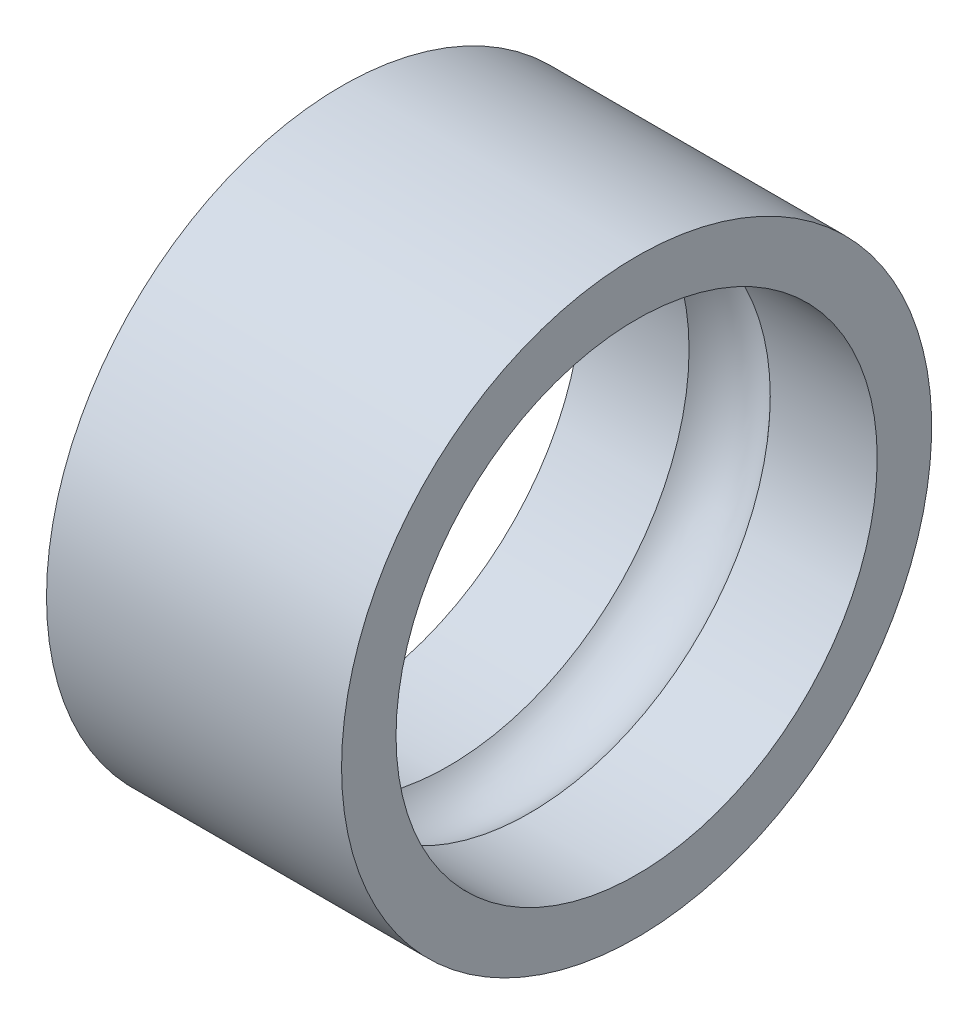
ISO-10303-21;
HEADER;
FILE_DESCRIPTION(('STEP AP214'),'2;1');
FILE_NAME('part.step','',(''),(''),'','','');
FILE_SCHEMA(('AUTOMOTIVE_DESIGN { 1 0 10303 214 1 1 1 1 }'));
ENDSEC;
DATA;
#1=APPLICATION_CONTEXT('core data for automotive mechanical design processes');
#2=APPLICATION_PROTOCOL_DEFINITION('international standard','automotive_design',2000,#1);
#3=PRODUCT_CONTEXT('',#1,'mechanical');
#4=PRODUCT('Part','Part','',(#3));
#5=PRODUCT_RELATED_PRODUCT_CATEGORY('part','',(#4));
#6=PRODUCT_DEFINITION_FORMATION('','',#4);
#7=PRODUCT_DEFINITION_CONTEXT('part definition',#1,'design');
#8=PRODUCT_DEFINITION('design','',#6,#7);
#9=PRODUCT_DEFINITION_SHAPE('','',#8);
#10=(LENGTH_UNIT() NAMED_UNIT(*) SI_UNIT(.MILLI.,.METRE.));
#11=(NAMED_UNIT(*) PLANE_ANGLE_UNIT() SI_UNIT($,.RADIAN.));
#12=(NAMED_UNIT(*) SI_UNIT($,.STERADIAN.) SOLID_ANGLE_UNIT());
#13=UNCERTAINTY_MEASURE_WITH_UNIT(LENGTH_MEASURE(1.E-05),#10,'distance_accuracy_value','');
#14=(GEOMETRIC_REPRESENTATION_CONTEXT(3) GLOBAL_UNCERTAINTY_ASSIGNED_CONTEXT((#13)) GLOBAL_UNIT_ASSIGNED_CONTEXT((#10,
#11,#12)) REPRESENTATION_CONTEXT('',''));
#15=CARTESIAN_POINT('',(0.,0.,0.));
#16=DIRECTION('',(0.,0.,1.));
#17=DIRECTION('',(1.,0.,0.));
#18=AXIS2_PLACEMENT_3D('',#15,#16,#17);
#19=CARTESIAN_POINT('',(10.,20.,0.));
#20=DIRECTION('',(-1.,0.,0.));
#21=DIRECTION('',(0.,0.,1.));
#22=AXIS2_PLACEMENT_3D('',#19,#20,#21);
#23=PLANE('',#22);
#24=CARTESIAN_POINT('',(10.,0.,0.));
#25=DIRECTION('',(-1.,0.,0.));
#26=DIRECTION('',(0.,0.,1.));
#27=AXIS2_PLACEMENT_3D('',#24,#25,#26);
#28=CIRCLE('',#27,20.);
#29=CARTESIAN_POINT('',(10.,0.,20.));
#30=VERTEX_POINT('',#29);
#31=EDGE_CURVE('E10',#30,#30,#28,.T.);
#32=ORIENTED_EDGE('',*,*,#31,.F.);
#33=EDGE_LOOP('',(#32));
#34=FACE_BOUND('',#33,.T.);
#35=CARTESIAN_POINT('',(10.,0.,0.));
#36=DIRECTION('',(-1.,0.,0.));
#37=DIRECTION('',(0.,0.,1.));
#38=AXIS2_PLACEMENT_3D('',#35,#36,#37);
#39=CIRCLE('',#38,16.30769231);
#40=CARTESIAN_POINT('',(10.,0.,16.30769231));
#41=VERTEX_POINT('',#40);
#42=EDGE_CURVE('E65',#41,#41,#39,.T.);
#43=ORIENTED_EDGE('',*,*,#42,.T.);
#44=EDGE_LOOP('',(#43));
#45=FACE_BOUND('',#44,.T.);
#46=ADVANCED_FACE('F43',(#34,#45),#23,.F.);
#47=CARTESIAN_POINT('',(0.,0.,0.));
#48=DIRECTION('',(-1.,0.,0.));
#49=DIRECTION('',(0.,0.,1.));
#50=AXIS2_PLACEMENT_3D('',#47,#48,#49);
#51=CYLINDRICAL_SURFACE('',#50,20.);
#52=CARTESIAN_POINT('',(-9.99999999999999,0.,0.));
#53=DIRECTION('',(-1.,0.,0.));
#54=DIRECTION('',(0.,0.,1.));
#55=AXIS2_PLACEMENT_3D('',#52,#53,#54);
#56=CIRCLE('',#55,20.);
#57=CARTESIAN_POINT('',(-9.99999999999999,0.,20.));
#58=VERTEX_POINT('',#57);
#59=EDGE_CURVE('E49',#58,#58,#56,.T.);
#60=ORIENTED_EDGE('',*,*,#59,.F.);
#61=EDGE_LOOP('',(#60));
#62=FACE_BOUND('',#61,.T.);
#63=ORIENTED_EDGE('',*,*,#31,.T.);
#64=EDGE_LOOP('',(#63));
#65=FACE_BOUND('',#64,.T.);
#66=ADVANCED_FACE('F90',(#62,#65),#51,.T.);
#67=CARTESIAN_POINT('',(-9.99999999999999,20.,0.));
#68=DIRECTION('',(1.,0.,0.));
#69=DIRECTION('',(0.,0.,-1.));
#70=AXIS2_PLACEMENT_3D('',#67,#68,#69);
#71=PLANE('',#70);
#72=CARTESIAN_POINT('',(-9.99999999999999,0.,0.));
#73=DIRECTION('',(-1.,0.,0.));
#74=DIRECTION('',(0.,0.,1.));
#75=AXIS2_PLACEMENT_3D('',#72,#73,#74);
#76=CIRCLE('',#75,16.30769231);
#77=CARTESIAN_POINT('',(-9.99999999999999,0.,16.30769231));
#78=VERTEX_POINT('',#77);
#79=EDGE_CURVE('E53',#78,#78,#76,.T.);
#80=ORIENTED_EDGE('',*,*,#79,.F.);
#81=EDGE_LOOP('',(#80));
#82=FACE_BOUND('',#81,.T.);
#83=ORIENTED_EDGE('',*,*,#59,.T.);
#84=EDGE_LOOP('',(#83));
#85=FACE_BOUND('',#84,.T.);
#86=ADVANCED_FACE('F85',(#82,#85),#71,.F.);
#87=CARTESIAN_POINT('',(0.,0.,0.));
#88=DIRECTION('',(-1.,0.,0.));
#89=DIRECTION('',(0.,0.,1.));
#90=AXIS2_PLACEMENT_3D('',#87,#88,#89);
#91=CYLINDRICAL_SURFACE('',#90,16.30769231);
#92=CARTESIAN_POINT('',(-2.75208366624918,0.,0.));
#93=DIRECTION('',(-1.,0.,0.));
#94=DIRECTION('',(0.,0.,1.));
#95=AXIS2_PLACEMENT_3D('',#92,#93,#94);
#96=CIRCLE('',#95,16.30769231);
#97=CARTESIAN_POINT('',(-2.75208366624918,0.,16.30769231));
#98=VERTEX_POINT('',#97);
#99=EDGE_CURVE('E57',#98,#98,#96,.T.);
#100=ORIENTED_EDGE('',*,*,#99,.F.);
#101=EDGE_LOOP('',(#100));
#102=FACE_BOUND('',#101,.T.);
#103=ORIENTED_EDGE('',*,*,#79,.T.);
#104=EDGE_LOOP('',(#103));
#105=FACE_BOUND('',#104,.T.);
#106=ADVANCED_FACE('F79',(#102,#105),#91,.F.);
#107=CARTESIAN_POINT('',(0.,0.,0.));
#108=DIRECTION('',(-1.,0.,0.));
#109=DIRECTION('',(0.,0.,1.));
#110=AXIS2_PLACEMENT_3D('',#107,#108,#109);
#111=TOROIDAL_SURFACE('',#110,13.84615385,3.6923076925);
#112=CARTESIAN_POINT('',(2.75208366624918,0.,0.));
#113=DIRECTION('',(-1.,0.,0.));
#114=DIRECTION('',(0.,0.,1.));
#115=AXIS2_PLACEMENT_3D('',#112,#113,#114);
#116=CIRCLE('',#115,16.30769231);
#117=CARTESIAN_POINT('',(2.75208366624918,0.,16.30769231));
#118=VERTEX_POINT('',#117);
#119=EDGE_CURVE('E62',#118,#118,#116,.T.);
#120=ORIENTED_EDGE('',*,*,#119,.F.);
#121=EDGE_LOOP('',(#120));
#122=FACE_BOUND('',#121,.T.);
#123=ORIENTED_EDGE('',*,*,#99,.T.);
#124=EDGE_LOOP('',(#123));
#125=FACE_BOUND('',#124,.T.);
#126=ADVANCED_FACE('F73',(#122,#125),#111,.F.);
#127=CARTESIAN_POINT('',(0.,0.,0.));
#128=DIRECTION('',(-1.,0.,0.));
#129=DIRECTION('',(0.,0.,1.));
#130=AXIS2_PLACEMENT_3D('',#127,#128,#129);
#131=CYLINDRICAL_SURFACE('',#130,16.30769231);
#132=ORIENTED_EDGE('',*,*,#42,.F.);
#133=EDGE_LOOP('',(#132));
#134=FACE_BOUND('',#133,.T.);
#135=ORIENTED_EDGE('',*,*,#119,.T.);
#136=EDGE_LOOP('',(#135));
#137=FACE_BOUND('',#136,.T.);
#138=ADVANCED_FACE('F70',(#134,#137),#131,.F.);
#139=CLOSED_SHELL('',(#46,#66,#86,#106,#126,#138));
#140=MANIFOLD_SOLID_BREP('B2',#139);
#141=ADVANCED_BREP_SHAPE_REPRESENTATION('',(#18,#140),#14);
#142=SHAPE_DEFINITION_REPRESENTATION(#9,#141);
ENDSEC;
END-ISO-10303-21;
